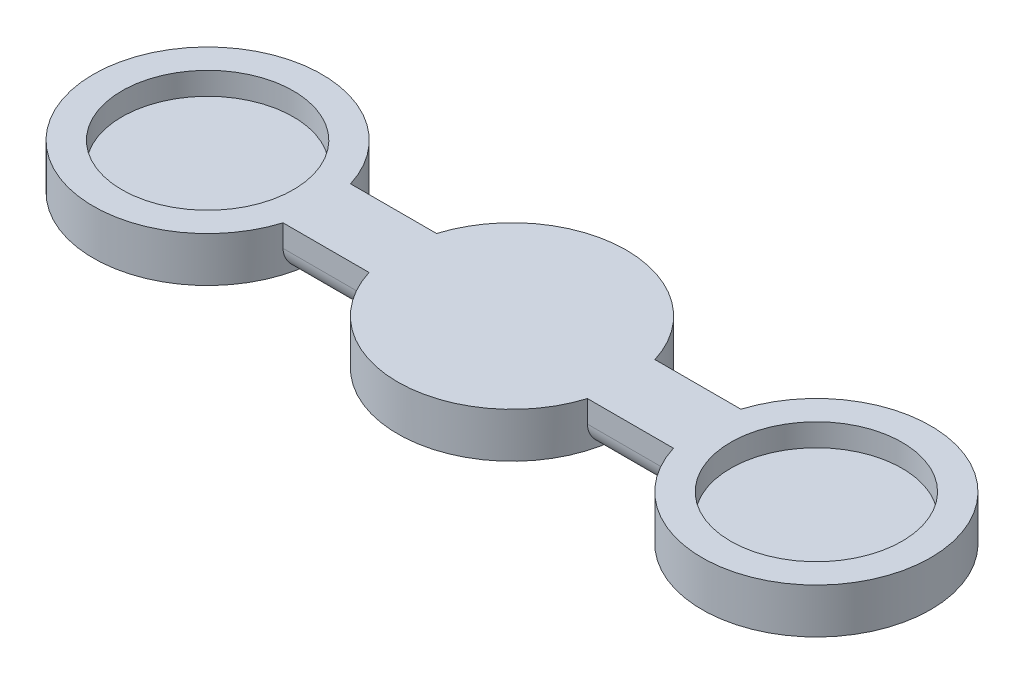
ISO-10303-21;
HEADER;
FILE_DESCRIPTION(('STEP AP214'),'2;1');
FILE_NAME('part.step','',(''),(''),'','','');
FILE_SCHEMA(('AUTOMOTIVE_DESIGN { 1 0 10303 214 1 1 1 1 }'));
ENDSEC;
DATA;
#1=APPLICATION_CONTEXT('core data for automotive mechanical design processes');
#2=APPLICATION_PROTOCOL_DEFINITION('international standard','automotive_design',2000,#1);
#3=PRODUCT_CONTEXT('',#1,'mechanical');
#4=PRODUCT('Part','Part','',(#3));
#5=PRODUCT_RELATED_PRODUCT_CATEGORY('part','',(#4));
#6=PRODUCT_DEFINITION_FORMATION('','',#4);
#7=PRODUCT_DEFINITION_CONTEXT('part definition',#1,'design');
#8=PRODUCT_DEFINITION('design','',#6,#7);
#9=PRODUCT_DEFINITION_SHAPE('','',#8);
#10=(LENGTH_UNIT() NAMED_UNIT(*) SI_UNIT(.MILLI.,.METRE.));
#11=(NAMED_UNIT(*) PLANE_ANGLE_UNIT() SI_UNIT($,.RADIAN.));
#12=(NAMED_UNIT(*) SI_UNIT($,.STERADIAN.) SOLID_ANGLE_UNIT());
#13=UNCERTAINTY_MEASURE_WITH_UNIT(LENGTH_MEASURE(1.E-05),#10,'distance_accuracy_value','');
#14=(GEOMETRIC_REPRESENTATION_CONTEXT(3) GLOBAL_UNCERTAINTY_ASSIGNED_CONTEXT((#13)) GLOBAL_UNIT_ASSIGNED_CONTEXT((#10,
#11,#12)) REPRESENTATION_CONTEXT('',''));
#15=CARTESIAN_POINT('',(0.,0.,0.));
#16=DIRECTION('',(0.,0.,1.));
#17=DIRECTION('',(1.,0.,0.));
#18=AXIS2_PLACEMENT_3D('',#15,#16,#17);
#19=CARTESIAN_POINT('',(38.1,-76.5682048894971,-3.75));
#20=DIRECTION('',(0.,0.,-1.));
#21=DIRECTION('',(-1.,0.,0.));
#22=AXIS2_PLACEMENT_3D('',#19,#20,#21);
#23=PLANE('',#22);
#24=DIRECTION('',(0.,1.,0.));
#25=VECTOR('',#24,1.);
#26=CARTESIAN_POINT('',(21.6853534964523,-35.9210244842766,-3.75));
#27=LINE('',#26,#25);
#28=CARTESIAN_POINT('',(21.6853534964523,5.,-3.75));
#29=VERTEX_POINT('',#28);
#30=CARTESIAN_POINT('',(21.6853534964523,2.54,-3.75));
#31=VERTEX_POINT('',#30);
#32=EDGE_CURVE('E145',#29,#31,#27,.F.);
#33=ORIENTED_EDGE('',*,*,#32,.T.);
#34=DIRECTION('',(1.,0.,0.));
#35=VECTOR('',#34,1.);
#36=CARTESIAN_POINT('',(12.1337339677446,2.54,-3.75));
#37=LINE('',#36,#35);
#38=CARTESIAN_POINT('',(12.1337339677446,2.54,-3.75));
#39=VERTEX_POINT('',#38);
#40=EDGE_CURVE('E55',#31,#39,#37,.F.);
#41=ORIENTED_EDGE('',*,*,#40,.T.);
#42=DIRECTION('',(0.,-1.,0.));
#43=VECTOR('',#42,1.);
#44=CARTESIAN_POINT('',(12.1337339677446,5.,-3.75));
#45=LINE('',#44,#43);
#46=CARTESIAN_POINT('',(12.1337339677446,5.,-3.75));
#47=VERTEX_POINT('',#46);
#48=EDGE_CURVE('E172',#47,#39,#45,.T.);
#49=ORIENTED_EDGE('',*,*,#48,.F.);
#50=DIRECTION('',(-1.,0.,0.));
#51=VECTOR('',#50,1.);
#52=CARTESIAN_POINT('',(38.1,5.,-3.75));
#53=LINE('',#52,#51);
#54=EDGE_CURVE('E163',#29,#47,#53,.T.);
#55=ORIENTED_EDGE('',*,*,#54,.F.);
#56=EDGE_LOOP('',(#33,#41,#49,#55));
#57=FACE_BOUND('',#56,.T.);
#58=ADVANCED_FACE('F35',(#57),#23,.T.);
#59=CARTESIAN_POINT('',(38.1,-76.5682048894971,3.75));
#60=DIRECTION('',(0.,0.,1.));
#61=DIRECTION('',(1.,0.,0.));
#62=AXIS2_PLACEMENT_3D('',#59,#60,#61);
#63=PLANE('',#62);
#64=DIRECTION('',(0.,-1.,0.));
#65=VECTOR('',#64,1.);
#66=CARTESIAN_POINT('',(12.1337339677446,5.,3.75));
#67=LINE('',#66,#65);
#68=CARTESIAN_POINT('',(12.1337339677446,2.54,3.75));
#69=VERTEX_POINT('',#68);
#70=CARTESIAN_POINT('',(12.1337339677446,5.,3.75));
#71=VERTEX_POINT('',#70);
#72=EDGE_CURVE('E165',#69,#71,#67,.F.);
#73=ORIENTED_EDGE('',*,*,#72,.F.);
#74=DIRECTION('',(-1.,0.,0.));
#75=VECTOR('',#74,1.);
#76=CARTESIAN_POINT('',(21.6853534964523,2.54,3.75));
#77=LINE('',#76,#75);
#78=CARTESIAN_POINT('',(21.6853534964523,2.54,3.75));
#79=VERTEX_POINT('',#78);
#80=EDGE_CURVE('E136',#69,#79,#77,.F.);
#81=ORIENTED_EDGE('',*,*,#80,.T.);
#82=DIRECTION('',(0.,1.,0.));
#83=VECTOR('',#82,1.);
#84=CARTESIAN_POINT('',(21.6853534964523,-35.9210244842766,3.75));
#85=LINE('',#84,#83);
#86=CARTESIAN_POINT('',(21.6853534964523,5.,3.75));
#87=VERTEX_POINT('',#86);
#88=EDGE_CURVE('E129',#79,#87,#85,.T.);
#89=ORIENTED_EDGE('',*,*,#88,.T.);
#90=DIRECTION('',(1.,0.,0.));
#91=VECTOR('',#90,1.);
#92=CARTESIAN_POINT('',(38.1,5.,3.75));
#93=LINE('',#92,#91);
#94=EDGE_CURVE('E134',#71,#87,#93,.T.);
#95=ORIENTED_EDGE('',*,*,#94,.F.);
#96=EDGE_LOOP('',(#73,#81,#89,#95));
#97=FACE_BOUND('',#96,.T.);
#98=ADVANCED_FACE('F132',(#97),#63,.T.);
#99=CARTESIAN_POINT('',(0.,5.,0.));
#100=DIRECTION('',(0.,-1.,0.));
#101=DIRECTION('',(0.,0.,-1.));
#102=AXIS2_PLACEMENT_3D('',#99,#100,#101);
#103=CYLINDRICAL_SURFACE('',#102,12.7);
#104=CARTESIAN_POINT('',(0.,5.,0.));
#105=DIRECTION('',(0.,1.,0.));
#106=DIRECTION('',(0.,0.,1.));
#107=AXIS2_PLACEMENT_3D('',#104,#105,#106);
#108=CIRCLE('',#107,12.7);
#109=CARTESIAN_POINT('',(-12.1337339677446,5.,-3.75));
#110=VERTEX_POINT('',#109);
#111=EDGE_CURVE('E176',#47,#110,#108,.T.);
#112=ORIENTED_EDGE('',*,*,#111,.F.);
#113=ORIENTED_EDGE('',*,*,#48,.T.);
#114=CARTESIAN_POINT('',(12.1337339677446,2.54,-3.75));
#115=CARTESIAN_POINT('',(12.1337267106759,2.47042101647963,-3.75000859014684));
#116=CARTESIAN_POINT('',(12.1346173962,2.4008471149802,-3.74714115294724));
#117=CARTESIAN_POINT('',(12.138140523404,2.2622249960764,-3.73572079855204));
#118=CARTESIAN_POINT('',(12.1407726279954,2.19317667954997,-3.72716898168615));
#119=CARTESIAN_POINT('',(12.1477162047294,2.05625756878811,-3.70447351906919));
#120=CARTESIAN_POINT('',(12.1520236525447,1.98838435688764,-3.69034327200321));
#121=CARTESIAN_POINT('',(12.16221050829,1.85414493105308,-3.65663006231119));
#122=CARTESIAN_POINT('',(12.1680899450976,1.78777874482743,-3.63704699951634));
#123=CARTESIAN_POINT('',(12.1878937600932,1.59165921757137,-3.57035360758052));
#124=CARTESIAN_POINT('',(12.2039918396905,1.46473164660199,-3.51527339301696));
#125=CARTESIAN_POINT('',(12.2405842125409,1.22199592976482,-3.38564695175041));
#126=CARTESIAN_POINT('',(12.2610801483872,1.10619196200689,-3.31109344953465));
#127=CARTESIAN_POINT('',(12.3053926369908,0.885634384142895,-3.14246516982098));
#128=CARTESIAN_POINT('',(12.3292807164847,0.781239191481393,-3.04793984472641));
#129=CARTESIAN_POINT('',(12.3781185536763,0.589550562868993,-2.84310601487674));
#130=CARTESIAN_POINT('',(12.4030686186906,0.50226211877402,-2.73279291935171));
#131=CARTESIAN_POINT('',(12.4530085146254,0.344571514540217,-2.49553780366392));
#132=CARTESIAN_POINT('',(12.4779754652555,0.274778723545853,-2.36818541641906));
#133=CARTESIAN_POINT('',(12.5253757766786,0.157790502165836,-2.10310374792295));
#134=CARTESIAN_POINT('',(12.5478108883306,0.110579381653727,-1.96538174888597));
#135=CARTESIAN_POINT('',(12.5828077195824,0.0504691797126505,-1.72429411153734));
#136=CARTESIAN_POINT('',(12.5963477042408,0.0315940101817567,-1.62252175749918));
#137=CARTESIAN_POINT('',(12.6211049782694,0.00635185329670237,-1.41722823856562));
#138=CARTESIAN_POINT('',(12.632323710267,-2.29238955946104E-05,-1.31370820336625));
#139=CARTESIAN_POINT('',(12.6422268608026,0.,-1.21));
#140=B_SPLINE_CURVE_WITH_KNOTS('',3,(#114,#115,#116,#117,#118,#119,#120,#121,#122,#123,#124,
#125,#126,#127,#128,#129,#130,#131,#132,#133,#134,#135,#136,#137,#138,#139),.UNSPECIFIED.,.F.,
.F.,(4,2,2,2,2,2,2,2,2,2,2,2,4),(0.,0.208663478006241,0.417286576621956,0.625411608074666,
0.833540463058928,1.2493372058622,1.66528951933578,2.09188126921971,2.51859731649117,
2.95858001548746,3.39825656137597,3.71067644117599,4.02290156911387),.UNSPECIFIED.);
#141=CARTESIAN_POINT('',(12.6422268608026,0.,-1.21));
#142=VERTEX_POINT('',#141);
#143=EDGE_CURVE('E11',#39,#142,#140,.T.);
#144=ORIENTED_EDGE('',*,*,#143,.T.);
#145=CARTESIAN_POINT('',(0.,0.,0.));
#146=DIRECTION('',(0.,1.,0.));
#147=DIRECTION('',(0.,0.,1.));
#148=AXIS2_PLACEMENT_3D('',#145,#146,#147);
#149=CIRCLE('',#148,12.7);
#150=CARTESIAN_POINT('',(-12.6422268608026,0.,-1.21));
#151=VERTEX_POINT('',#150);
#152=EDGE_CURVE('E177',#142,#151,#149,.T.);
#153=ORIENTED_EDGE('',*,*,#152,.T.);
#154=CARTESIAN_POINT('',(-12.6422268608026,0.,-1.21));
#155=CARTESIAN_POINT('',(-12.635363189309,-7.37480134893954E-06,-1.28177456180848));
#156=CARTESIAN_POINT('',(-12.6278772957531,0.00304212649818228,-1.3534827343012));
#157=CARTESIAN_POINT('',(-12.6117553475697,0.0151662244195231,-1.49624427813935));
#158=CARTESIAN_POINT('',(-12.6031195134354,0.0242396673183539,-1.56729777222925));
#159=CARTESIAN_POINT('',(-12.5848051976947,0.0483021262249493,-1.70813331107003));
#160=CARTESIAN_POINT('',(-12.5751285544083,0.0632808329332383,-1.77791735108035));
#161=CARTESIAN_POINT('',(-12.5548567941436,0.0990017473545197,-1.91583905428578));
#162=CARTESIAN_POINT('',(-12.5442616538056,0.119744101681211,-1.98397667555192));
#163=CARTESIAN_POINT('',(-12.5113270932727,0.190371589577659,-2.18519625710414));
#164=CARTESIAN_POINT('',(-12.4878179570083,0.248684000018617,-2.31524037432878));
#165=CARTESIAN_POINT('',(-12.4392294188867,0.385993266987123,-2.56352065957093));
#166=CARTESIAN_POINT('',(-12.4141495987934,0.464995650740712,-2.68175366062885));
#167=CARTESIAN_POINT('',(-12.3637269632784,0.643199825933734,-2.90544932716968));
#168=CARTESIAN_POINT('',(-12.3383874650999,0.742737573341073,-3.01064581446539));
#169=CARTESIAN_POINT('',(-12.289896403962,0.958545756290192,-3.20285832571577));
#170=CARTESIAN_POINT('',(-12.2667451607189,1.07481863068566,-3.28987169525768));
#171=CARTESIAN_POINT('',(-12.2246512757251,1.32086084652636,-3.442995490797));
#172=CARTESIAN_POINT('',(-12.2057026230347,1.45061051676425,-3.5091358294221));
#173=CARTESIAN_POINT('',(-12.1737589524138,1.7200834414184,-3.61840604872824));
#174=CARTESIAN_POINT('',(-12.1607575837594,1.85979587203163,-3.66156048272229));
#175=CARTESIAN_POINT('',(-12.1455694232864,2.09049273365634,-3.71154100243842));
#176=CARTESIAN_POINT('',(-12.1411495226549,2.17975876210679,-3.72594402538419));
#177=CARTESIAN_POINT('',(-12.1352249711678,2.35933305846595,-3.74517647654297));
#178=CARTESIAN_POINT('',(-12.133717828905,2.44964036914135,-3.75001408654577));
#179=CARTESIAN_POINT('',(-12.1337339677446,2.54,-3.75));
#180=B_SPLINE_CURVE_WITH_KNOTS('',3,(#154,#155,#156,#157,#158,#159,#160,#161,#162,#163,#164,
#165,#166,#167,#168,#169,#170,#171,#172,#173,#174,#175,#176,#177,#178,#179),.UNSPECIFIED.,.F.,
.F.,(4,2,2,2,2,2,2,2,2,2,2,2,4),(0.,0.216227719391881,0.432414038158191,0.648224602354778,
0.864040656769404,1.29520149170173,1.72647762686269,2.16546615042273,2.60451871382316,
3.04293919417483,3.48089041417568,3.75195965989665,4.02279694567446),.UNSPECIFIED.);
#181=CARTESIAN_POINT('',(-12.1337339677446,2.54,-3.75));
#182=VERTEX_POINT('',#181);
#183=EDGE_CURVE('E239',#151,#182,#180,.T.);
#184=ORIENTED_EDGE('',*,*,#183,.T.);
#185=DIRECTION('',(0.,-1.,0.));
#186=VECTOR('',#185,1.);
#187=CARTESIAN_POINT('',(-12.1337339677446,5.,-3.75));
#188=LINE('',#187,#186);
#189=EDGE_CURVE('E170',#182,#110,#188,.F.);
#190=ORIENTED_EDGE('',*,*,#189,.T.);
#191=EDGE_LOOP('',(#112,#113,#144,#153,#184,#190));
#192=FACE_BOUND('',#191,.T.);
#193=ADVANCED_FACE('F294',(#192),#103,.T.);
#194=CARTESIAN_POINT('',(-12.1337339677446,5.,3.75));
#195=VERTEX_POINT('',#194);
#196=EDGE_CURVE('E154',#195,#71,#108,.T.);
#197=ORIENTED_EDGE('',*,*,#196,.F.);
#198=DIRECTION('',(0.,-1.,0.));
#199=VECTOR('',#198,1.);
#200=CARTESIAN_POINT('',(-12.1337339677446,5.,3.75));
#201=LINE('',#200,#199);
#202=CARTESIAN_POINT('',(-12.1337339677446,2.54,3.75));
#203=VERTEX_POINT('',#202);
#204=EDGE_CURVE('E167',#195,#203,#201,.T.);
#205=ORIENTED_EDGE('',*,*,#204,.T.);
#206=CARTESIAN_POINT('',(-12.1337339677446,2.54,3.75));
#207=CARTESIAN_POINT('',(-12.1337267106759,2.47042101647963,3.75000859014684));
#208=CARTESIAN_POINT('',(-12.1346173962,2.4008471149802,3.74714115294724));
#209=CARTESIAN_POINT('',(-12.138140523404,2.2622249960764,3.73572079855204));
#210=CARTESIAN_POINT('',(-12.1407726279954,2.19317667954997,3.72716898168615));
#211=CARTESIAN_POINT('',(-12.1477162047294,2.05625756878811,3.70447351906919));
#212=CARTESIAN_POINT('',(-12.1520236525447,1.98838435688764,3.69034327200321));
#213=CARTESIAN_POINT('',(-12.16221050829,1.85414493105308,3.65663006231119));
#214=CARTESIAN_POINT('',(-12.1680899450976,1.78777874482743,3.63704699951634));
#215=CARTESIAN_POINT('',(-12.1878937600932,1.59165921757137,3.57035360758052));
#216=CARTESIAN_POINT('',(-12.2039918396905,1.46473164660199,3.51527339301697));
#217=CARTESIAN_POINT('',(-12.2405842125409,1.22199592976482,3.38564695175041));
#218=CARTESIAN_POINT('',(-12.2610801483872,1.10619196200689,3.31109344953465));
#219=CARTESIAN_POINT('',(-12.3053926369908,0.885634384142894,3.14246516982099));
#220=CARTESIAN_POINT('',(-12.3292807164847,0.781239191481392,3.04793984472641));
#221=CARTESIAN_POINT('',(-12.3781185536763,0.589550562868993,2.84310601487674));
#222=CARTESIAN_POINT('',(-12.4030686186906,0.502262118774019,2.73279291935171));
#223=CARTESIAN_POINT('',(-12.4530085146254,0.344571514540217,2.49553780366392));
#224=CARTESIAN_POINT('',(-12.4779754652555,0.274778723545853,2.36818541641906));
#225=CARTESIAN_POINT('',(-12.5253757766786,0.157790502165836,2.10310374792295));
#226=CARTESIAN_POINT('',(-12.5478108883306,0.110579381653727,1.96538174888597));
#227=CARTESIAN_POINT('',(-12.5828077195824,0.0504691797126505,1.72429411153734));
#228=CARTESIAN_POINT('',(-12.5963477042408,0.031594010181757,1.62252175749919));
#229=CARTESIAN_POINT('',(-12.6211049782694,0.00635185329670299,1.41722823856562));
#230=CARTESIAN_POINT('',(-12.632323710267,-2.29238955940782E-05,1.31370820336625));
#231=CARTESIAN_POINT('',(-12.6422268608026,0.,1.21));
#232=B_SPLINE_CURVE_WITH_KNOTS('',3,(#206,#207,#208,#209,#210,#211,#212,#213,#214,#215,#216,
#217,#218,#219,#220,#221,#222,#223,#224,#225,#226,#227,#228,#229,#230,#231),.UNSPECIFIED.,.F.,
.F.,(4,2,2,2,2,2,2,2,2,2,2,2,4),(0.,0.208663478006241,0.417286576621955,0.625411608074665,
0.833540463058927,1.2493372058622,1.66528951933578,2.09188126921971,2.51859731649117,
2.95858001548746,3.39825656137597,3.71067644117599,4.02290156911387),.UNSPECIFIED.);
#233=CARTESIAN_POINT('',(-12.6422268608026,0.,1.21));
#234=VERTEX_POINT('',#233);
#235=EDGE_CURVE('E233',#203,#234,#232,.T.);
#236=ORIENTED_EDGE('',*,*,#235,.T.);
#237=CARTESIAN_POINT('',(12.6422268608026,0.,1.21));
#238=VERTEX_POINT('',#237);
#239=EDGE_CURVE('E174',#234,#238,#149,.T.);
#240=ORIENTED_EDGE('',*,*,#239,.T.);
#241=CARTESIAN_POINT('',(12.6422268608026,0.,1.21));
#242=CARTESIAN_POINT('',(12.635363189309,-7.37480134896556E-06,1.28177456180848));
#243=CARTESIAN_POINT('',(12.6278772957531,0.00304212649818212,1.3534827343012));
#244=CARTESIAN_POINT('',(12.6117553475697,0.0151662244195228,1.49624427813935));
#245=CARTESIAN_POINT('',(12.6031195134354,0.0242396673183536,1.56729777222925));
#246=CARTESIAN_POINT('',(12.5848051976947,0.0483021262249492,1.70813331107003));
#247=CARTESIAN_POINT('',(12.5751285544083,0.0632808329332386,1.77791735108035));
#248=CARTESIAN_POINT('',(12.5548567941436,0.0990017473545201,1.91583905428578));
#249=CARTESIAN_POINT('',(12.5442616538056,0.119744101681211,1.98397667555192));
#250=CARTESIAN_POINT('',(12.5113270932727,0.190371589577658,2.18519625710414));
#251=CARTESIAN_POINT('',(12.4878179570083,0.248684000018616,2.31524037432878));
#252=CARTESIAN_POINT('',(12.4392294188867,0.385993266987123,2.56352065957093));
#253=CARTESIAN_POINT('',(12.4141495987934,0.464995650740712,2.68175366062885));
#254=CARTESIAN_POINT('',(12.3637269632784,0.643199825933734,2.90544932716968));
#255=CARTESIAN_POINT('',(12.3383874650999,0.742737573341072,3.01064581446539));
#256=CARTESIAN_POINT('',(12.289896403962,0.958545756290191,3.20285832571577));
#257=CARTESIAN_POINT('',(12.2667451607189,1.07481863068566,3.28987169525768));
#258=CARTESIAN_POINT('',(12.2246512757251,1.32086084652636,3.442995490797));
#259=CARTESIAN_POINT('',(12.2057026230347,1.45061051676424,3.5091358294221));
#260=CARTESIAN_POINT('',(12.1737589524138,1.7200834414184,3.61840604872824));
#261=CARTESIAN_POINT('',(12.1607575837593,1.85979587203163,3.66156048272229));
#262=CARTESIAN_POINT('',(12.1455694232864,2.09049273365634,3.71154100243842));
#263=CARTESIAN_POINT('',(12.1411495226549,2.17975876210679,3.72594402538419));
#264=CARTESIAN_POINT('',(12.1352249711678,2.35933305846595,3.74517647654297));
#265=CARTESIAN_POINT('',(12.133717828905,2.44964036914135,3.75001408654578));
#266=CARTESIAN_POINT('',(12.1337339677446,2.54,3.75));
#267=B_SPLINE_CURVE_WITH_KNOTS('',3,(#241,#242,#243,#244,#245,#246,#247,#248,#249,#250,#251,
#252,#253,#254,#255,#256,#257,#258,#259,#260,#261,#262,#263,#264,#265,#266),.UNSPECIFIED.,.F.,
.F.,(4,2,2,2,2,2,2,2,2,2,2,2,4),(0.,0.216227719391882,0.432414038158192,0.648224602354779,
0.864040656769404,1.29520149170173,1.72647762686269,2.16546615042273,2.60451871382316,
3.04293919417483,3.48089041417568,3.75195965989666,4.02279694567446),.UNSPECIFIED.);
#268=EDGE_CURVE('E198',#238,#69,#267,.T.);
#269=ORIENTED_EDGE('',*,*,#268,.T.);
#270=ORIENTED_EDGE('',*,*,#72,.T.);
#271=EDGE_LOOP('',(#197,#205,#236,#240,#269,#270));
#272=FACE_BOUND('',#271,.T.);
#273=ADVANCED_FACE('F210',(#272),#103,.T.);
#274=CARTESIAN_POINT('',(0.,5.,0.));
#275=DIRECTION('',(0.,1.,0.));
#276=DIRECTION('',(0.,0.,1.));
#277=AXIS2_PLACEMENT_3D('',#274,#275,#276);
#278=PLANE('',#277);
#279=CARTESIAN_POINT('',(33.8190874641969,5.,0.));
#280=DIRECTION('',(0.,-1.,0.));
#281=DIRECTION('',(0.,0.,1.));
#282=AXIS2_PLACEMENT_3D('',#279,#280,#281);
#283=CIRCLE('',#282,9.525);
#284=CARTESIAN_POINT('',(33.8190874641969,5.,9.525));
#285=VERTEX_POINT('',#284);
#286=EDGE_CURVE('E446',#285,#285,#283,.T.);
#287=ORIENTED_EDGE('',*,*,#286,.T.);
#288=EDGE_LOOP('',(#287));
#289=FACE_BOUND('',#288,.T.);
#290=CARTESIAN_POINT('',(-33.8190874641969,5.,0.));
#291=DIRECTION('',(0.,1.,0.));
#292=DIRECTION('',(0.,0.,1.));
#293=AXIS2_PLACEMENT_3D('',#290,#291,#292);
#294=CIRCLE('',#293,9.525);
#295=CARTESIAN_POINT('',(-33.8190874641969,5.,9.525));
#296=VERTEX_POINT('',#295);
#297=EDGE_CURVE('E302',#296,#296,#294,.T.);
#298=ORIENTED_EDGE('',*,*,#297,.F.);
#299=EDGE_LOOP('',(#298));
#300=FACE_BOUND('',#299,.T.);
#301=ORIENTED_EDGE('',*,*,#94,.T.);
#302=CARTESIAN_POINT('',(33.8190874641969,5.,0.));
#303=DIRECTION('',(0.,-1.,0.));
#304=DIRECTION('',(0.,0.,1.));
#305=AXIS2_PLACEMENT_3D('',#302,#303,#304);
#306=CIRCLE('',#305,12.7);
#307=EDGE_CURVE('E143',#29,#87,#306,.T.);
#308=ORIENTED_EDGE('',*,*,#307,.F.);
#309=ORIENTED_EDGE('',*,*,#54,.T.);
#310=ORIENTED_EDGE('',*,*,#111,.T.);
#311=CARTESIAN_POINT('',(-21.6853534964523,5.,-3.75));
#312=VERTEX_POINT('',#311);
#313=EDGE_CURVE('E158',#110,#312,#53,.T.);
#314=ORIENTED_EDGE('',*,*,#313,.T.);
#315=CARTESIAN_POINT('',(-33.8190874641969,5.,0.));
#316=DIRECTION('',(0.,1.,0.));
#317=DIRECTION('',(0.,0.,1.));
#318=AXIS2_PLACEMENT_3D('',#315,#316,#317);
#319=CIRCLE('',#318,12.7);
#320=CARTESIAN_POINT('',(-21.6853534964523,5.,3.75));
#321=VERTEX_POINT('',#320);
#322=EDGE_CURVE('E285',#312,#321,#319,.T.);
#323=ORIENTED_EDGE('',*,*,#322,.T.);
#324=EDGE_CURVE('E155',#321,#195,#93,.T.);
#325=ORIENTED_EDGE('',*,*,#324,.T.);
#326=ORIENTED_EDGE('',*,*,#196,.T.);
#327=EDGE_LOOP('',(#301,#308,#309,#310,#314,#323,#325,#326));
#328=FACE_BOUND('',#327,.T.);
#329=ADVANCED_FACE('F152',(#289,#300,#328),#278,.T.);
#330=CARTESIAN_POINT('',(0.,0.,0.));
#331=DIRECTION('',(0.,1.,0.));
#332=DIRECTION('',(0.,0.,1.));
#333=AXIS2_PLACEMENT_3D('',#330,#331,#332);
#334=PLANE('',#333);
#335=DIRECTION('',(-1.,0.,0.));
#336=VECTOR('',#335,1.);
#337=CARTESIAN_POINT('',(12.1337339677446,0.,1.21));
#338=LINE('',#337,#336);
#339=CARTESIAN_POINT('',(21.1768606033942,0.,1.21));
#340=VERTEX_POINT('',#339);
#341=EDGE_CURVE('E189',#340,#238,#338,.T.);
#342=ORIENTED_EDGE('',*,*,#341,.T.);
#343=ORIENTED_EDGE('',*,*,#239,.F.);
#344=DIRECTION('',(-1.,0.,0.));
#345=VECTOR('',#344,1.);
#346=CARTESIAN_POINT('',(-21.6853534964523,0.,1.21));
#347=LINE('',#346,#345);
#348=CARTESIAN_POINT('',(-21.1768606033943,0.,1.21));
#349=VERTEX_POINT('',#348);
#350=EDGE_CURVE('E186',#234,#349,#347,.T.);
#351=ORIENTED_EDGE('',*,*,#350,.T.);
#352=CARTESIAN_POINT('',(-33.8190874641969,0.,0.));
#353=DIRECTION('',(0.,1.,0.));
#354=DIRECTION('',(0.,0.,1.));
#355=AXIS2_PLACEMENT_3D('',#352,#353,#354);
#356=CIRCLE('',#355,12.7);
#357=CARTESIAN_POINT('',(-21.1768606033942,0.,-1.21));
#358=VERTEX_POINT('',#357);
#359=EDGE_CURVE('E159',#349,#358,#356,.F.);
#360=ORIENTED_EDGE('',*,*,#359,.T.);
#361=DIRECTION('',(1.,0.,0.));
#362=VECTOR('',#361,1.);
#363=CARTESIAN_POINT('',(-12.1337339677446,0.,-1.21));
#364=LINE('',#363,#362);
#365=EDGE_CURVE('E183',#358,#151,#364,.T.);
#366=ORIENTED_EDGE('',*,*,#365,.T.);
#367=ORIENTED_EDGE('',*,*,#152,.F.);
#368=DIRECTION('',(1.,0.,0.));
#369=VECTOR('',#368,1.);
#370=CARTESIAN_POINT('',(21.6853534964523,0.,-1.21));
#371=LINE('',#370,#369);
#372=CARTESIAN_POINT('',(21.1768606033943,0.,-1.21));
#373=VERTEX_POINT('',#372);
#374=EDGE_CURVE('E139',#142,#373,#371,.T.);
#375=ORIENTED_EDGE('',*,*,#374,.T.);
#376=CARTESIAN_POINT('',(33.8190874641969,0.,0.));
#377=DIRECTION('',(0.,1.,0.));
#378=DIRECTION('',(0.,0.,1.));
#379=AXIS2_PLACEMENT_3D('',#376,#377,#378);
#380=CIRCLE('',#379,12.7);
#381=EDGE_CURVE('E148',#340,#373,#380,.T.);
#382=ORIENTED_EDGE('',*,*,#381,.F.);
#383=EDGE_LOOP('',(#342,#343,#351,#360,#366,#367,#375,#382));
#384=FACE_BOUND('',#383,.T.);
#385=ADVANCED_FACE('F267',(#384),#334,.F.);
#386=DIRECTION('',(0.,1.,0.));
#387=VECTOR('',#386,1.);
#388=CARTESIAN_POINT('',(-21.6853534964523,-35.9210244842766,3.75));
#389=LINE('',#388,#387);
#390=CARTESIAN_POINT('',(-21.6853534964523,2.54,3.75));
#391=VERTEX_POINT('',#390);
#392=EDGE_CURVE('E156',#391,#321,#389,.T.);
#393=ORIENTED_EDGE('',*,*,#392,.F.);
#394=DIRECTION('',(-1.,0.,0.));
#395=VECTOR('',#394,1.);
#396=CARTESIAN_POINT('',(-12.1337339677446,2.54,3.75));
#397=LINE('',#396,#395);
#398=EDGE_CURVE('E193',#391,#203,#397,.F.);
#399=ORIENTED_EDGE('',*,*,#398,.T.);
#400=ORIENTED_EDGE('',*,*,#204,.F.);
#401=ORIENTED_EDGE('',*,*,#324,.F.);
#402=EDGE_LOOP('',(#393,#399,#400,#401));
#403=FACE_BOUND('',#402,.T.);
#404=ADVANCED_FACE('F264',(#403),#63,.T.);
#405=ORIENTED_EDGE('',*,*,#189,.F.);
#406=DIRECTION('',(1.,0.,0.));
#407=VECTOR('',#406,1.);
#408=CARTESIAN_POINT('',(-21.6853534964523,2.54,-3.75));
#409=LINE('',#408,#407);
#410=CARTESIAN_POINT('',(-21.6853534964523,2.54,-3.75));
#411=VERTEX_POINT('',#410);
#412=EDGE_CURVE('E195',#182,#411,#409,.F.);
#413=ORIENTED_EDGE('',*,*,#412,.T.);
#414=DIRECTION('',(0.,1.,0.));
#415=VECTOR('',#414,1.);
#416=CARTESIAN_POINT('',(-21.6853534964523,-35.9210244842766,-3.75));
#417=LINE('',#416,#415);
#418=EDGE_CURVE('E140',#312,#411,#417,.F.);
#419=ORIENTED_EDGE('',*,*,#418,.F.);
#420=ORIENTED_EDGE('',*,*,#313,.F.);
#421=EDGE_LOOP('',(#405,#413,#419,#420));
#422=FACE_BOUND('',#421,.T.);
#423=ADVANCED_FACE('F258',(#422),#23,.T.);
#424=CARTESIAN_POINT('',(-33.8190874641969,-35.9210244842766,0.));
#425=DIRECTION('',(0.,1.,0.));
#426=DIRECTION('',(0.,0.,1.));
#427=AXIS2_PLACEMENT_3D('',#424,#425,#426);
#428=CYLINDRICAL_SURFACE('',#427,12.7);
#429=ORIENTED_EDGE('',*,*,#359,.F.);
#430=CARTESIAN_POINT('',(-21.1768606033943,0.,1.21));
#431=CARTESIAN_POINT('',(-21.1837242748879,-7.37480134867346E-06,1.28177456180849));
#432=CARTESIAN_POINT('',(-21.1912101684438,0.00304212649818248,1.3534827343012));
#433=CARTESIAN_POINT('',(-21.2073321166272,0.015166224419523,1.49624427813935));
#434=CARTESIAN_POINT('',(-21.2159679507615,0.0242396673183536,1.56729777222926));
#435=CARTESIAN_POINT('',(-21.2342822665022,0.0483021262249488,1.70813331107004));
#436=CARTESIAN_POINT('',(-21.2439589097886,0.063280832933238,1.77791735108035));
#437=CARTESIAN_POINT('',(-21.2642306700533,0.0990017473545195,1.91583905428578));
#438=CARTESIAN_POINT('',(-21.2748258103913,0.119744101681211,1.98397667555193));
#439=CARTESIAN_POINT('',(-21.3077603709242,0.190371589577658,2.18519625710414));
#440=CARTESIAN_POINT('',(-21.3312695071886,0.248684000018616,2.31524037432878));
#441=CARTESIAN_POINT('',(-21.3798580453102,0.385993266987121,2.56352065957093));
#442=CARTESIAN_POINT('',(-21.4049378654036,0.464995650740711,2.68175366062885));
#443=CARTESIAN_POINT('',(-21.4553605009185,0.643199825933733,2.90544932716968));
#444=CARTESIAN_POINT('',(-21.4806999990971,0.742737573341072,3.01064581446539));
#445=CARTESIAN_POINT('',(-21.5291910602349,0.958545756290191,3.20285832571577));
#446=CARTESIAN_POINT('',(-21.552342303478,1.07481863068566,3.28987169525768));
#447=CARTESIAN_POINT('',(-21.5944361884718,1.32086084652636,3.442995490797));
#448=CARTESIAN_POINT('',(-21.6133848411622,1.45061051676424,3.50913582942211));
#449=CARTESIAN_POINT('',(-21.6453285117831,1.72008344141839,3.61840604872825));
#450=CARTESIAN_POINT('',(-21.6583298804375,1.85979587203163,3.6615604827223));
#451=CARTESIAN_POINT('',(-21.6735180409105,2.09049273365634,3.71154100243842));
#452=CARTESIAN_POINT('',(-21.677937941542,2.17975876210679,3.72594402538419));
#453=CARTESIAN_POINT('',(-21.6838624930291,2.35933305846595,3.74517647654298));
#454=CARTESIAN_POINT('',(-21.6853696352919,2.44964036914135,3.75001408654578));
#455=CARTESIAN_POINT('',(-21.6853534964523,2.54,3.75));
#456=B_SPLINE_CURVE_WITH_KNOTS('',3,(#430,#431,#432,#433,#434,#435,#436,#437,#438,#439,#440,
#441,#442,#443,#444,#445,#446,#447,#448,#449,#450,#451,#452,#453,#454,#455),.UNSPECIFIED.,.F.,
.F.,(4,2,2,2,2,2,2,2,2,2,2,2,4),(0.,0.216227719391881,0.432414038158191,0.648224602354778,
0.864040656769403,1.29520149170173,1.72647762686269,2.16546615042273,2.60451871382316,
3.04293919417483,3.48089041417568,3.75195965989665,4.02279694567446),.UNSPECIFIED.);
#457=EDGE_CURVE('E227',#349,#391,#456,.T.);
#458=ORIENTED_EDGE('',*,*,#457,.T.);
#459=ORIENTED_EDGE('',*,*,#392,.T.);
#460=ORIENTED_EDGE('',*,*,#322,.F.);
#461=ORIENTED_EDGE('',*,*,#418,.T.);
#462=CARTESIAN_POINT('',(-21.6853534964523,2.54,-3.75));
#463=CARTESIAN_POINT('',(-21.685360753521,2.47042101647963,-3.75000859014684));
#464=CARTESIAN_POINT('',(-21.6844700679969,2.4008471149802,-3.74714115294724));
#465=CARTESIAN_POINT('',(-21.6809469407929,2.2622249960764,-3.73572079855204));
#466=CARTESIAN_POINT('',(-21.6783148362015,2.19317667954997,-3.72716898168614));
#467=CARTESIAN_POINT('',(-21.6713712594675,2.05625756878811,-3.70447351906919));
#468=CARTESIAN_POINT('',(-21.6670638116522,1.98838435688764,-3.69034327200321));
#469=CARTESIAN_POINT('',(-21.6568769559069,1.85414493105308,-3.65663006231119));
#470=CARTESIAN_POINT('',(-21.6509975190993,1.78777874482743,-3.63704699951633));
#471=CARTESIAN_POINT('',(-21.6311937041037,1.59165921757137,-3.57035360758052));
#472=CARTESIAN_POINT('',(-21.6150956245064,1.46473164660199,-3.51527339301696));
#473=CARTESIAN_POINT('',(-21.578503251656,1.22199592976482,-3.38564695175041));
#474=CARTESIAN_POINT('',(-21.5580073158097,1.10619196200689,-3.31109344953465));
#475=CARTESIAN_POINT('',(-21.5136948272061,0.885634384142895,-3.14246516982098));
#476=CARTESIAN_POINT('',(-21.4898067477122,0.781239191481393,-3.0479398447264));
#477=CARTESIAN_POINT('',(-21.4409689105206,0.589550562868993,-2.84310601487674));
#478=CARTESIAN_POINT('',(-21.4160188455063,0.50226211877402,-2.73279291935171));
#479=CARTESIAN_POINT('',(-21.3660789495715,0.344571514540217,-2.49553780366391));
#480=CARTESIAN_POINT('',(-21.3411119989414,0.274778723545853,-2.36818541641905));
#481=CARTESIAN_POINT('',(-21.2937116875183,0.157790502165837,-2.10310374792294));
#482=CARTESIAN_POINT('',(-21.2712765758663,0.110579381653727,-1.96538174888597));
#483=CARTESIAN_POINT('',(-21.2362797446145,0.0504691797126508,-1.72429411153734));
#484=CARTESIAN_POINT('',(-21.2227397599561,0.0315940101817568,-1.62252175749918));
#485=CARTESIAN_POINT('',(-21.1979824859275,0.00635185329670222,-1.41722823856561));
#486=CARTESIAN_POINT('',(-21.1867637539299,-2.29238955948667E-05,-1.31370820336625));
#487=CARTESIAN_POINT('',(-21.1768606033943,0.,-1.21));
#488=B_SPLINE_CURVE_WITH_KNOTS('',3,(#462,#463,#464,#465,#466,#467,#468,#469,#470,#471,#472,
#473,#474,#475,#476,#477,#478,#479,#480,#481,#482,#483,#484,#485,#486,#487),.UNSPECIFIED.,.F.,
.F.,(4,2,2,2,2,2,2,2,2,2,2,2,4),(0.,0.208663478006241,0.417286576621955,0.625411608074665,
0.833540463058927,1.2493372058622,1.66528951933578,2.09188126921971,2.51859731649117,
2.95858001548746,3.39825656137597,3.71067644117599,4.02290156911387),.UNSPECIFIED.);
#489=EDGE_CURVE('E244',#411,#358,#488,.T.);
#490=ORIENTED_EDGE('',*,*,#489,.T.);
#491=EDGE_LOOP('',(#429,#458,#459,#460,#461,#490));
#492=FACE_BOUND('',#491,.T.);
#493=ADVANCED_FACE('F252',(#492),#428,.T.);
#494=CARTESIAN_POINT('',(-33.8190874641969,2.5,0.));
#495=DIRECTION('',(0.,1.,0.));
#496=DIRECTION('',(0.,0.,1.));
#497=AXIS2_PLACEMENT_3D('',#494,#495,#496);
#498=CYLINDRICAL_SURFACE('',#497,9.525);
#499=CARTESIAN_POINT('',(-33.8190874641969,2.5,0.));
#500=DIRECTION('',(0.,1.,0.));
#501=DIRECTION('',(0.,0.,1.));
#502=AXIS2_PLACEMENT_3D('',#499,#500,#501);
#503=CIRCLE('',#502,9.525);
#504=CARTESIAN_POINT('',(-33.8190874641969,2.5,9.525));
#505=VERTEX_POINT('',#504);
#506=EDGE_CURVE('E437',#505,#505,#503,.T.);
#507=ORIENTED_EDGE('',*,*,#506,.F.);
#508=EDGE_LOOP('',(#507));
#509=FACE_BOUND('',#508,.T.);
#510=ORIENTED_EDGE('',*,*,#297,.T.);
#511=EDGE_LOOP('',(#510));
#512=FACE_BOUND('',#511,.T.);
#513=ADVANCED_FACE('F257',(#509,#512),#498,.F.);
#514=CARTESIAN_POINT('',(-33.8190874641969,2.5,0.));
#515=DIRECTION('',(0.,1.,0.));
#516=DIRECTION('',(0.,0.,1.));
#517=AXIS2_PLACEMENT_3D('',#514,#515,#516);
#518=PLANE('',#517);
#519=ORIENTED_EDGE('',*,*,#506,.T.);
#520=EDGE_LOOP('',(#519));
#521=FACE_BOUND('',#520,.T.);
#522=ADVANCED_FACE('F343',(#521),#518,.T.);
#523=CARTESIAN_POINT('',(33.8190874641969,-35.9210244842766,0.));
#524=DIRECTION('',(0.,1.,0.));
#525=DIRECTION('',(0.,0.,1.));
#526=AXIS2_PLACEMENT_3D('',#523,#524,#525);
#527=CYLINDRICAL_SURFACE('',#526,12.7);
#528=ORIENTED_EDGE('',*,*,#32,.F.);
#529=ORIENTED_EDGE('',*,*,#307,.T.);
#530=ORIENTED_EDGE('',*,*,#88,.F.);
#531=CARTESIAN_POINT('',(21.6853534964523,2.54,3.75));
#532=CARTESIAN_POINT('',(21.685360753521,2.47042101647963,3.75000859014684));
#533=CARTESIAN_POINT('',(21.6844700679969,2.4008471149802,3.74714115294724));
#534=CARTESIAN_POINT('',(21.6809469407929,2.2622249960764,3.73572079855204));
#535=CARTESIAN_POINT('',(21.6783148362015,2.19317667954997,3.72716898168614));
#536=CARTESIAN_POINT('',(21.6713712594675,2.05625756878811,3.70447351906919));
#537=CARTESIAN_POINT('',(21.6670638116522,1.98838435688764,3.69034327200321));
#538=CARTESIAN_POINT('',(21.6568769559069,1.85414493105308,3.65663006231119));
#539=CARTESIAN_POINT('',(21.6509975190993,1.78777874482743,3.63704699951634));
#540=CARTESIAN_POINT('',(21.6311937041037,1.59165921757137,3.57035360758052));
#541=CARTESIAN_POINT('',(21.6150956245064,1.46473164660199,3.51527339301696));
#542=CARTESIAN_POINT('',(21.578503251656,1.22199592976482,3.38564695175041));
#543=CARTESIAN_POINT('',(21.5580073158097,1.10619196200689,3.31109344953465));
#544=CARTESIAN_POINT('',(21.5136948272061,0.885634384142895,3.14246516982098));
#545=CARTESIAN_POINT('',(21.4898067477122,0.781239191481393,3.0479398447264));
#546=CARTESIAN_POINT('',(21.4409689105206,0.589550562868993,2.84310601487674));
#547=CARTESIAN_POINT('',(21.4160188455063,0.50226211877402,2.73279291935171));
#548=CARTESIAN_POINT('',(21.3660789495715,0.344571514540217,2.49553780366392));
#549=CARTESIAN_POINT('',(21.3411119989414,0.274778723545854,2.36818541641905));
#550=CARTESIAN_POINT('',(21.2937116875183,0.157790502165837,2.10310374792294));
#551=CARTESIAN_POINT('',(21.2712765758663,0.110579381653727,1.96538174888597));
#552=CARTESIAN_POINT('',(21.2362797446145,0.0504691797126503,1.72429411153734));
#553=CARTESIAN_POINT('',(21.2227397599561,0.0315940101817564,1.62252175749918));
#554=CARTESIAN_POINT('',(21.1979824859275,0.00635185329670209,1.41722823856562));
#555=CARTESIAN_POINT('',(21.1867637539299,-2.29238955948322E-05,1.31370820336625));
#556=CARTESIAN_POINT('',(21.1768606033943,0.,1.21));
#557=B_SPLINE_CURVE_WITH_KNOTS('',3,(#531,#532,#533,#534,#535,#536,#537,#538,#539,#540,#541,
#542,#543,#544,#545,#546,#547,#548,#549,#550,#551,#552,#553,#554,#555,#556),.UNSPECIFIED.,.F.,
.F.,(4,2,2,2,2,2,2,2,2,2,2,2,4),(0.,0.208663478006241,0.417286576621955,0.625411608074665,
0.833540463058927,1.2493372058622,1.66528951933578,2.09188126921971,2.51859731649117,
2.95858001548746,3.39825656137597,3.71067644117599,4.02290156911387),.UNSPECIFIED.);
#558=EDGE_CURVE('E204',#79,#340,#557,.T.);
#559=ORIENTED_EDGE('',*,*,#558,.T.);
#560=ORIENTED_EDGE('',*,*,#381,.T.);
#561=CARTESIAN_POINT('',(21.1768606033943,0.,-1.21));
#562=CARTESIAN_POINT('',(21.1837242748879,-7.37480134890551E-06,-1.28177456180849));
#563=CARTESIAN_POINT('',(21.1912101684438,0.00304212649818226,-1.3534827343012));
#564=CARTESIAN_POINT('',(21.2073321166272,0.015166224419523,-1.49624427813935));
#565=CARTESIAN_POINT('',(21.2159679507615,0.0242396673183538,-1.56729777222926));
#566=CARTESIAN_POINT('',(21.2342822665022,0.0483021262249492,-1.70813331107004));
#567=CARTESIAN_POINT('',(21.2439589097886,0.0632808329332382,-1.77791735108035));
#568=CARTESIAN_POINT('',(21.2642306700533,0.0990017473545195,-1.91583905428578));
#569=CARTESIAN_POINT('',(21.2748258103913,0.119744101681211,-1.98397667555193));
#570=CARTESIAN_POINT('',(21.3077603709242,0.190371589577658,-2.18519625710414));
#571=CARTESIAN_POINT('',(21.3312695071886,0.248684000018616,-2.31524037432878));
#572=CARTESIAN_POINT('',(21.3798580453102,0.385993266987121,-2.56352065957093));
#573=CARTESIAN_POINT('',(21.4049378654036,0.464995650740711,-2.68175366062885));
#574=CARTESIAN_POINT('',(21.4553605009185,0.643199825933733,-2.90544932716968));
#575=CARTESIAN_POINT('',(21.4806999990971,0.742737573341072,-3.01064581446539));
#576=CARTESIAN_POINT('',(21.5291910602349,0.958545756290191,-3.20285832571577));
#577=CARTESIAN_POINT('',(21.552342303478,1.07481863068566,-3.28987169525768));
#578=CARTESIAN_POINT('',(21.5944361884718,1.32086084652636,-3.442995490797));
#579=CARTESIAN_POINT('',(21.6133848411622,1.45061051676424,-3.5091358294221));
#580=CARTESIAN_POINT('',(21.6453285117831,1.72008344141839,-3.61840604872825));
#581=CARTESIAN_POINT('',(21.6583298804375,1.85979587203163,-3.6615604827223));
#582=CARTESIAN_POINT('',(21.6735180409105,2.09049273365634,-3.71154100243842));
#583=CARTESIAN_POINT('',(21.677937941542,2.17975876210679,-3.72594402538419));
#584=CARTESIAN_POINT('',(21.6838624930291,2.35933305846595,-3.74517647654297));
#585=CARTESIAN_POINT('',(21.6853696352919,2.44964036914135,-3.75001408654578));
#586=CARTESIAN_POINT('',(21.6853534964523,2.54,-3.75));
#587=B_SPLINE_CURVE_WITH_KNOTS('',3,(#561,#562,#563,#564,#565,#566,#567,#568,#569,#570,#571,
#572,#573,#574,#575,#576,#577,#578,#579,#580,#581,#582,#583,#584,#585,#586),.UNSPECIFIED.,.F.,
.F.,(4,2,2,2,2,2,2,2,2,2,2,2,4),(0.,0.216227719391881,0.432414038158191,0.648224602354777,
0.864040656769403,1.29520149170173,1.72647762686269,2.16546615042273,2.60451871382316,
3.04293919417483,3.48089041417568,3.75195965989665,4.02279694567446),.UNSPECIFIED.);
#588=EDGE_CURVE('E48',#373,#31,#587,.T.);
#589=ORIENTED_EDGE('',*,*,#588,.T.);
#590=EDGE_LOOP('',(#528,#529,#530,#559,#560,#589));
#591=FACE_BOUND('',#590,.T.);
#592=ADVANCED_FACE('F144',(#591),#527,.T.);
#593=CARTESIAN_POINT('',(33.8190874641969,2.5,0.));
#594=DIRECTION('',(0.,1.,0.));
#595=DIRECTION('',(0.,0.,1.));
#596=AXIS2_PLACEMENT_3D('',#593,#594,#595);
#597=CYLINDRICAL_SURFACE('',#596,9.525);
#598=CARTESIAN_POINT('',(33.8190874641969,2.5,0.));
#599=DIRECTION('',(0.,-1.,0.));
#600=DIRECTION('',(0.,0.,1.));
#601=AXIS2_PLACEMENT_3D('',#598,#599,#600);
#602=CIRCLE('',#601,9.525);
#603=CARTESIAN_POINT('',(33.8190874641969,2.5,9.525));
#604=VERTEX_POINT('',#603);
#605=EDGE_CURVE('E149',#604,#604,#602,.T.);
#606=ORIENTED_EDGE('',*,*,#605,.T.);
#607=EDGE_LOOP('',(#606));
#608=FACE_BOUND('',#607,.T.);
#609=ORIENTED_EDGE('',*,*,#286,.F.);
#610=EDGE_LOOP('',(#609));
#611=FACE_BOUND('',#610,.T.);
#612=ADVANCED_FACE('F327',(#608,#611),#597,.F.);
#613=CARTESIAN_POINT('',(33.8190874641969,2.5,0.));
#614=DIRECTION('',(0.,1.,0.));
#615=DIRECTION('',(0.,0.,1.));
#616=AXIS2_PLACEMENT_3D('',#613,#614,#615);
#617=PLANE('',#616);
#618=ORIENTED_EDGE('',*,*,#605,.F.);
#619=EDGE_LOOP('',(#618));
#620=FACE_BOUND('',#619,.T.);
#621=ADVANCED_FACE('F218',(#620),#617,.T.);
#622=CARTESIAN_POINT('',(0.,2.54,1.21));
#623=DIRECTION('',(1.,0.,0.));
#624=DIRECTION('',(0.,0.,-1.));
#625=AXIS2_PLACEMENT_3D('',#622,#623,#624);
#626=CYLINDRICAL_SURFACE('',#625,2.54);
#627=ORIENTED_EDGE('',*,*,#558,.F.);
#628=ORIENTED_EDGE('',*,*,#80,.F.);
#629=ORIENTED_EDGE('',*,*,#268,.F.);
#630=ORIENTED_EDGE('',*,*,#341,.F.);
#631=EDGE_LOOP('',(#627,#628,#629,#630));
#632=FACE_BOUND('',#631,.T.);
#633=ADVANCED_FACE('F213',(#632),#626,.T.);
#634=CARTESIAN_POINT('',(0.,2.54,1.21));
#635=DIRECTION('',(1.,0.,0.));
#636=DIRECTION('',(0.,0.,-1.));
#637=AXIS2_PLACEMENT_3D('',#634,#635,#636);
#638=CYLINDRICAL_SURFACE('',#637,2.54);
#639=ORIENTED_EDGE('',*,*,#235,.F.);
#640=ORIENTED_EDGE('',*,*,#398,.F.);
#641=ORIENTED_EDGE('',*,*,#457,.F.);
#642=ORIENTED_EDGE('',*,*,#350,.F.);
#643=EDGE_LOOP('',(#639,#640,#641,#642));
#644=FACE_BOUND('',#643,.T.);
#645=ADVANCED_FACE('F217',(#644),#638,.T.);
#646=CARTESIAN_POINT('',(0.,2.54,-1.21));
#647=DIRECTION('',(-1.,0.,0.));
#648=DIRECTION('',(0.,0.,1.));
#649=AXIS2_PLACEMENT_3D('',#646,#647,#648);
#650=CYLINDRICAL_SURFACE('',#649,2.54);
#651=ORIENTED_EDGE('',*,*,#489,.F.);
#652=ORIENTED_EDGE('',*,*,#412,.F.);
#653=ORIENTED_EDGE('',*,*,#183,.F.);
#654=ORIENTED_EDGE('',*,*,#365,.F.);
#655=EDGE_LOOP('',(#651,#652,#653,#654));
#656=FACE_BOUND('',#655,.T.);
#657=ADVANCED_FACE('F223',(#656),#650,.T.);
#658=CARTESIAN_POINT('',(0.,2.54,-1.21));
#659=DIRECTION('',(-1.,0.,0.));
#660=DIRECTION('',(0.,0.,1.));
#661=AXIS2_PLACEMENT_3D('',#658,#659,#660);
#662=CYLINDRICAL_SURFACE('',#661,2.54);
#663=ORIENTED_EDGE('',*,*,#143,.F.);
#664=ORIENTED_EDGE('',*,*,#40,.F.);
#665=ORIENTED_EDGE('',*,*,#588,.F.);
#666=ORIENTED_EDGE('',*,*,#374,.F.);
#667=EDGE_LOOP('',(#663,#664,#665,#666));
#668=FACE_BOUND('',#667,.T.);
#669=ADVANCED_FACE('F37',(#668),#662,.T.);
#670=CLOSED_SHELL('',(#58,#98,#193,#273,#329,#385,#404,#423,#493,#513,#522,#592,#612,#621,#633,
#645,#657,#669));
#671=MANIFOLD_SOLID_BREP('B2',#670);
#672=ADVANCED_BREP_SHAPE_REPRESENTATION('',(#18,#671),#14);
#673=SHAPE_DEFINITION_REPRESENTATION(#9,#672);
ENDSEC;
END-ISO-10303-21;
